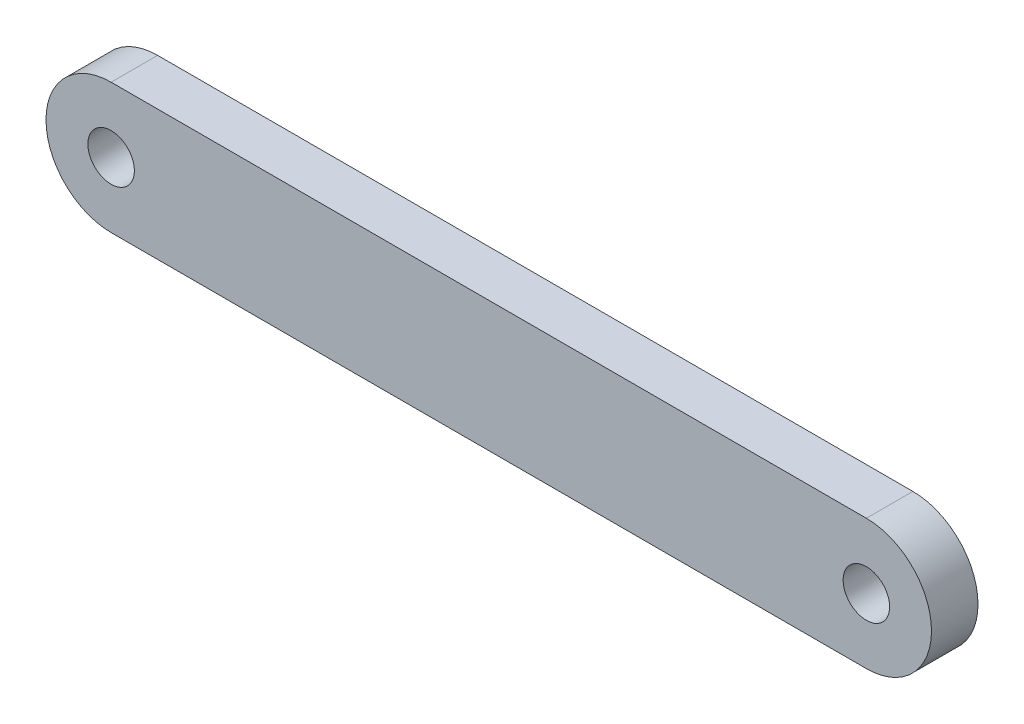
ISO-10303-21;
HEADER;
FILE_DESCRIPTION(('STEP AP214'),'2;1');
FILE_NAME('part.step','',(''),(''),'','','');
FILE_SCHEMA(('AUTOMOTIVE_DESIGN { 1 0 10303 214 1 1 1 1 }'));
ENDSEC;
DATA;
#1=APPLICATION_CONTEXT('core data for automotive mechanical design processes');
#2=APPLICATION_PROTOCOL_DEFINITION('international standard','automotive_design',2000,#1);
#3=PRODUCT_CONTEXT('',#1,'mechanical');
#4=PRODUCT('Part','Part','',(#3));
#5=PRODUCT_RELATED_PRODUCT_CATEGORY('part','',(#4));
#6=PRODUCT_DEFINITION_FORMATION('','',#4);
#7=PRODUCT_DEFINITION_CONTEXT('part definition',#1,'design');
#8=PRODUCT_DEFINITION('design','',#6,#7);
#9=PRODUCT_DEFINITION_SHAPE('','',#8);
#10=(LENGTH_UNIT() NAMED_UNIT(*) SI_UNIT(.MILLI.,.METRE.));
#11=(NAMED_UNIT(*) PLANE_ANGLE_UNIT() SI_UNIT($,.RADIAN.));
#12=(NAMED_UNIT(*) SI_UNIT($,.STERADIAN.) SOLID_ANGLE_UNIT());
#13=UNCERTAINTY_MEASURE_WITH_UNIT(LENGTH_MEASURE(1.E-05),#10,'distance_accuracy_value','');
#14=(GEOMETRIC_REPRESENTATION_CONTEXT(3) GLOBAL_UNCERTAINTY_ASSIGNED_CONTEXT((#13)) GLOBAL_UNIT_ASSIGNED_CONTEXT((#10,
#11,#12)) REPRESENTATION_CONTEXT('',''));
#15=CARTESIAN_POINT('',(0.,0.,0.));
#16=DIRECTION('',(0.,0.,1.));
#17=DIRECTION('',(1.,0.,0.));
#18=AXIS2_PLACEMENT_3D('',#15,#16,#17);
#19=CARTESIAN_POINT('',(84.3864064793297,0.253504378838441,6.35));
#20=DIRECTION('',(0.,0.,-1.));
#21=DIRECTION('',(-1.,0.,0.));
#22=AXIS2_PLACEMENT_3D('',#19,#20,#21);
#23=PLANE('',#22);
#24=CARTESIAN_POINT('',(84.3864064793297,0.253504378838441,6.35));
#25=DIRECTION('',(0.,0.,1.));
#26=DIRECTION('',(-1.,0.,0.));
#27=AXIS2_PLACEMENT_3D('',#24,#25,#26);
#28=CIRCLE('',#27,8.89);
#29=CARTESIAN_POINT('',(84.3864064793297,-8.63649562116156,6.35));
#30=VERTEX_POINT('',#29);
#31=CARTESIAN_POINT('',(84.3864064793297,9.14350437883844,6.35));
#32=VERTEX_POINT('',#31);
#33=EDGE_CURVE('E98',#30,#32,#28,.T.);
#34=ORIENTED_EDGE('',*,*,#33,.T.);
#35=DIRECTION('',(-1.,0.,0.));
#36=VECTOR('',#35,1.);
#37=CARTESIAN_POINT('',(-18.7121935206703,9.14350437883844,6.35));
#38=LINE('',#37,#36);
#39=CARTESIAN_POINT('',(-18.7121935206703,9.14350437883844,6.35));
#40=VERTEX_POINT('',#39);
#41=EDGE_CURVE('E91',#32,#40,#38,.T.);
#42=ORIENTED_EDGE('',*,*,#41,.T.);
#43=CARTESIAN_POINT('',(-18.7121935206703,0.253504378838441,6.35));
#44=DIRECTION('',(0.,0.,1.));
#45=DIRECTION('',(1.,0.,0.));
#46=AXIS2_PLACEMENT_3D('',#43,#44,#45);
#47=CIRCLE('',#46,8.89);
#48=CARTESIAN_POINT('',(-18.7121935206703,-8.63649562116156,6.35));
#49=VERTEX_POINT('',#48);
#50=EDGE_CURVE('E96',#40,#49,#47,.T.);
#51=ORIENTED_EDGE('',*,*,#50,.T.);
#52=DIRECTION('',(1.,0.,0.));
#53=VECTOR('',#52,1.);
#54=CARTESIAN_POINT('',(-18.7121935206703,-8.63649562116156,6.35));
#55=LINE('',#54,#53);
#56=EDGE_CURVE('E64',#49,#30,#55,.T.);
#57=ORIENTED_EDGE('',*,*,#56,.T.);
#58=EDGE_LOOP('',(#34,#42,#51,#57));
#59=FACE_BOUND('',#58,.T.);
#60=CARTESIAN_POINT('',(-18.7121935206703,0.253504378838441,6.35));
#61=DIRECTION('',(0.,0.,1.));
#62=DIRECTION('',(1.,0.,0.));
#63=AXIS2_PLACEMENT_3D('',#60,#61,#62);
#64=CIRCLE('',#63,3.175);
#65=CARTESIAN_POINT('',(-15.5371935206703,0.253504378838441,6.35));
#66=VERTEX_POINT('',#65);
#67=EDGE_CURVE('E119',#66,#66,#64,.T.);
#68=ORIENTED_EDGE('',*,*,#67,.F.);
#69=EDGE_LOOP('',(#68));
#70=FACE_BOUND('',#69,.T.);
#71=CARTESIAN_POINT('',(84.3864064793297,0.253504378838441,6.35));
#72=DIRECTION('',(0.,0.,1.));
#73=DIRECTION('',(1.,0.,0.));
#74=AXIS2_PLACEMENT_3D('',#71,#72,#73);
#75=CIRCLE('',#74,3.175);
#76=CARTESIAN_POINT('',(87.5614064793297,0.253504378838441,6.35));
#77=VERTEX_POINT('',#76);
#78=EDGE_CURVE('E139',#77,#77,#75,.T.);
#79=ORIENTED_EDGE('',*,*,#78,.F.);
#80=EDGE_LOOP('',(#79));
#81=FACE_BOUND('',#80,.T.);
#82=ADVANCED_FACE('F44',(#59,#70,#81),#23,.F.);
#83=CARTESIAN_POINT('',(84.3864064793297,0.253504378838441,0.));
#84=DIRECTION('',(0.,0.,-1.));
#85=DIRECTION('',(-1.,0.,0.));
#86=AXIS2_PLACEMENT_3D('',#83,#84,#85);
#87=PLANE('',#86);
#88=CARTESIAN_POINT('',(-18.7121935206703,0.253504378838441,0.));
#89=DIRECTION('',(0.,0.,1.));
#90=DIRECTION('',(1.,0.,0.));
#91=AXIS2_PLACEMENT_3D('',#88,#89,#90);
#92=CIRCLE('',#91,3.175);
#93=CARTESIAN_POINT('',(-15.5371935206703,0.253504378838441,0.));
#94=VERTEX_POINT('',#93);
#95=EDGE_CURVE('E136',#94,#94,#92,.T.);
#96=ORIENTED_EDGE('',*,*,#95,.T.);
#97=EDGE_LOOP('',(#96));
#98=FACE_BOUND('',#97,.T.);
#99=CARTESIAN_POINT('',(84.3864064793297,0.253504378838441,0.));
#100=DIRECTION('',(0.,0.,1.));
#101=DIRECTION('',(-1.,0.,0.));
#102=AXIS2_PLACEMENT_3D('',#99,#100,#101);
#103=CIRCLE('',#102,8.89);
#104=CARTESIAN_POINT('',(84.3864064793297,-8.63649562116156,0.));
#105=VERTEX_POINT('',#104);
#106=CARTESIAN_POINT('',(84.3864064793297,9.14350437883844,0.));
#107=VERTEX_POINT('',#106);
#108=EDGE_CURVE('E111',#105,#107,#103,.T.);
#109=ORIENTED_EDGE('',*,*,#108,.F.);
#110=DIRECTION('',(1.,0.,0.));
#111=VECTOR('',#110,1.);
#112=CARTESIAN_POINT('',(-18.7121935206703,-8.63649562116156,0.));
#113=LINE('',#112,#111);
#114=CARTESIAN_POINT('',(-18.7121935206703,-8.63649562116156,0.));
#115=VERTEX_POINT('',#114);
#116=EDGE_CURVE('E88',#115,#105,#113,.T.);
#117=ORIENTED_EDGE('',*,*,#116,.F.);
#118=CARTESIAN_POINT('',(-18.7121935206703,0.253504378838441,0.));
#119=DIRECTION('',(0.,0.,1.));
#120=DIRECTION('',(1.,0.,0.));
#121=AXIS2_PLACEMENT_3D('',#118,#119,#120);
#122=CIRCLE('',#121,8.89);
#123=CARTESIAN_POINT('',(-18.7121935206703,9.14350437883844,0.));
#124=VERTEX_POINT('',#123);
#125=EDGE_CURVE('E78',#124,#115,#122,.T.);
#126=ORIENTED_EDGE('',*,*,#125,.F.);
#127=DIRECTION('',(-1.,0.,0.));
#128=VECTOR('',#127,1.);
#129=CARTESIAN_POINT('',(-18.7121935206703,9.14350437883844,0.));
#130=LINE('',#129,#128);
#131=EDGE_CURVE('E103',#107,#124,#130,.T.);
#132=ORIENTED_EDGE('',*,*,#131,.F.);
#133=EDGE_LOOP('',(#109,#117,#126,#132));
#134=FACE_BOUND('',#133,.T.);
#135=CARTESIAN_POINT('',(84.3864064793297,0.253504378838441,0.));
#136=DIRECTION('',(0.,0.,1.));
#137=DIRECTION('',(1.,0.,0.));
#138=AXIS2_PLACEMENT_3D('',#135,#136,#137);
#139=CIRCLE('',#138,3.175);
#140=CARTESIAN_POINT('',(87.5614064793297,0.253504378838441,0.));
#141=VERTEX_POINT('',#140);
#142=EDGE_CURVE('E145',#141,#141,#139,.T.);
#143=ORIENTED_EDGE('',*,*,#142,.T.);
#144=EDGE_LOOP('',(#143));
#145=FACE_BOUND('',#144,.T.);
#146=ADVANCED_FACE('F132',(#98,#134,#145),#87,.T.);
#147=CARTESIAN_POINT('',(84.3864064793297,0.253504378838441,6.35));
#148=DIRECTION('',(0.,0.,-1.));
#149=DIRECTION('',(-1.,0.,0.));
#150=AXIS2_PLACEMENT_3D('',#147,#148,#149);
#151=CYLINDRICAL_SURFACE('',#150,8.89);
#152=ORIENTED_EDGE('',*,*,#108,.T.);
#153=DIRECTION('',(0.,0.,-1.));
#154=VECTOR('',#153,1.);
#155=CARTESIAN_POINT('',(84.3864064793297,9.14350437883844,6.35));
#156=LINE('',#155,#154);
#157=EDGE_CURVE('E11',#32,#107,#156,.T.);
#158=ORIENTED_EDGE('',*,*,#157,.F.);
#159=ORIENTED_EDGE('',*,*,#33,.F.);
#160=DIRECTION('',(0.,0.,-1.));
#161=VECTOR('',#160,1.);
#162=CARTESIAN_POINT('',(84.3864064793297,-8.63649562116156,6.35));
#163=LINE('',#162,#161);
#164=EDGE_CURVE('E109',#30,#105,#163,.T.);
#165=ORIENTED_EDGE('',*,*,#164,.T.);
#166=EDGE_LOOP('',(#152,#158,#159,#165));
#167=FACE_BOUND('',#166,.T.);
#168=ADVANCED_FACE('F50',(#167),#151,.T.);
#169=CARTESIAN_POINT('',(-18.7121935206703,9.14350437883844,6.35));
#170=DIRECTION('',(0.,-1.,0.));
#171=DIRECTION('',(0.,0.,-1.));
#172=AXIS2_PLACEMENT_3D('',#169,#170,#171);
#173=PLANE('',#172);
#174=ORIENTED_EDGE('',*,*,#131,.T.);
#175=DIRECTION('',(0.,0.,-1.));
#176=VECTOR('',#175,1.);
#177=CARTESIAN_POINT('',(-18.7121935206703,9.14350437883844,6.35));
#178=LINE('',#177,#176);
#179=EDGE_CURVE('E54',#40,#124,#178,.T.);
#180=ORIENTED_EDGE('',*,*,#179,.F.);
#181=ORIENTED_EDGE('',*,*,#41,.F.);
#182=ORIENTED_EDGE('',*,*,#157,.T.);
#183=EDGE_LOOP('',(#174,#180,#181,#182));
#184=FACE_BOUND('',#183,.T.);
#185=ADVANCED_FACE('F105',(#184),#173,.F.);
#186=CARTESIAN_POINT('',(-18.7121935206703,0.253504378838441,6.35));
#187=DIRECTION('',(0.,0.,-1.));
#188=DIRECTION('',(-1.,0.,0.));
#189=AXIS2_PLACEMENT_3D('',#186,#187,#188);
#190=CYLINDRICAL_SURFACE('',#189,8.89);
#191=ORIENTED_EDGE('',*,*,#125,.T.);
#192=DIRECTION('',(0.,0.,-1.));
#193=VECTOR('',#192,1.);
#194=CARTESIAN_POINT('',(-18.7121935206703,-8.63649562116156,6.35));
#195=LINE('',#194,#193);
#196=EDGE_CURVE('E104',#49,#115,#195,.T.);
#197=ORIENTED_EDGE('',*,*,#196,.F.);
#198=ORIENTED_EDGE('',*,*,#50,.F.);
#199=ORIENTED_EDGE('',*,*,#179,.T.);
#200=EDGE_LOOP('',(#191,#197,#198,#199));
#201=FACE_BOUND('',#200,.T.);
#202=ADVANCED_FACE('F106',(#201),#190,.T.);
#203=CARTESIAN_POINT('',(-18.7121935206703,-8.63649562116156,6.35));
#204=DIRECTION('',(0.,1.,0.));
#205=DIRECTION('',(0.,0.,1.));
#206=AXIS2_PLACEMENT_3D('',#203,#204,#205);
#207=PLANE('',#206);
#208=ORIENTED_EDGE('',*,*,#116,.T.);
#209=ORIENTED_EDGE('',*,*,#164,.F.);
#210=ORIENTED_EDGE('',*,*,#56,.F.);
#211=ORIENTED_EDGE('',*,*,#196,.T.);
#212=EDGE_LOOP('',(#208,#209,#210,#211));
#213=FACE_BOUND('',#212,.T.);
#214=ADVANCED_FACE('F126',(#213),#207,.F.);
#215=CARTESIAN_POINT('',(-18.7121935206703,0.253504378838441,6.35));
#216=DIRECTION('',(0.,0.,-1.));
#217=DIRECTION('',(-1.,0.,0.));
#218=AXIS2_PLACEMENT_3D('',#215,#216,#217);
#219=CYLINDRICAL_SURFACE('',#218,3.175);
#220=ORIENTED_EDGE('',*,*,#67,.T.);
#221=EDGE_LOOP('',(#220));
#222=FACE_BOUND('',#221,.T.);
#223=ORIENTED_EDGE('',*,*,#95,.F.);
#224=EDGE_LOOP('',(#223));
#225=FACE_BOUND('',#224,.T.);
#226=ADVANCED_FACE('F162',(#222,#225),#219,.F.);
#227=CARTESIAN_POINT('',(84.3864064793297,0.253504378838441,6.35));
#228=DIRECTION('',(0.,0.,-1.));
#229=DIRECTION('',(-1.,0.,0.));
#230=AXIS2_PLACEMENT_3D('',#227,#228,#229);
#231=CYLINDRICAL_SURFACE('',#230,3.175);
#232=ORIENTED_EDGE('',*,*,#78,.T.);
#233=EDGE_LOOP('',(#232));
#234=FACE_BOUND('',#233,.T.);
#235=ORIENTED_EDGE('',*,*,#142,.F.);
#236=EDGE_LOOP('',(#235));
#237=FACE_BOUND('',#236,.T.);
#238=ADVANCED_FACE('F155',(#234,#237),#231,.F.);
#239=CLOSED_SHELL('',(#82,#146,#168,#185,#202,#214,#226,#238));
#240=MANIFOLD_SOLID_BREP('B2',#239);
#241=ADVANCED_BREP_SHAPE_REPRESENTATION('',(#18,#240),#14);
#242=SHAPE_DEFINITION_REPRESENTATION(#9,#241);
ENDSEC;
END-ISO-10303-21;
